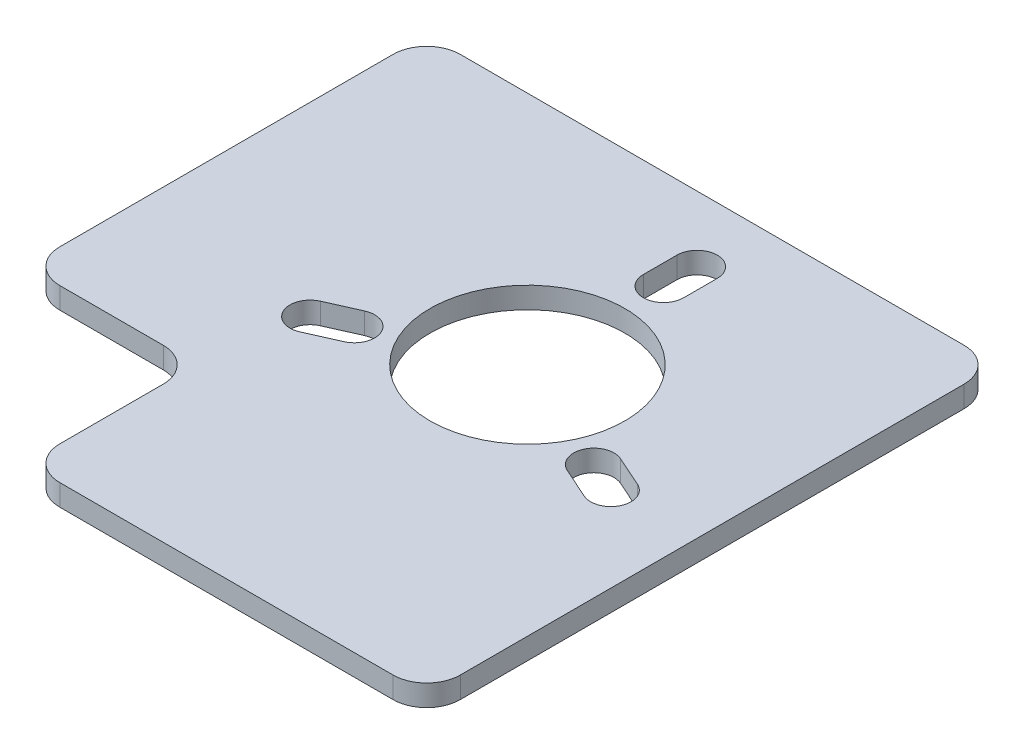
ISO-10303-21;
HEADER;
FILE_DESCRIPTION(('STEP AP214'),'2;1');
FILE_NAME('part.step','',(''),(''),'','','');
FILE_SCHEMA(('AUTOMOTIVE_DESIGN { 1 0 10303 214 1 1 1 1 }'));
ENDSEC;
DATA;
#1=APPLICATION_CONTEXT('core data for automotive mechanical design processes');
#2=APPLICATION_PROTOCOL_DEFINITION('international standard','automotive_design',2000,#1);
#3=PRODUCT_CONTEXT('',#1,'mechanical');
#4=PRODUCT('Part','Part','',(#3));
#5=PRODUCT_RELATED_PRODUCT_CATEGORY('part','',(#4));
#6=PRODUCT_DEFINITION_FORMATION('','',#4);
#7=PRODUCT_DEFINITION_CONTEXT('part definition',#1,'design');
#8=PRODUCT_DEFINITION('design','',#6,#7);
#9=PRODUCT_DEFINITION_SHAPE('','',#8);
#10=(LENGTH_UNIT() NAMED_UNIT(*) SI_UNIT(.MILLI.,.METRE.));
#11=(NAMED_UNIT(*) PLANE_ANGLE_UNIT() SI_UNIT($,.RADIAN.));
#12=(NAMED_UNIT(*) SI_UNIT($,.STERADIAN.) SOLID_ANGLE_UNIT());
#13=UNCERTAINTY_MEASURE_WITH_UNIT(LENGTH_MEASURE(1.E-05),#10,'distance_accuracy_value','');
#14=(GEOMETRIC_REPRESENTATION_CONTEXT(3) GLOBAL_UNCERTAINTY_ASSIGNED_CONTEXT((#13)) GLOBAL_UNIT_ASSIGNED_CONTEXT((#10,
#11,#12)) REPRESENTATION_CONTEXT('',''));
#15=CARTESIAN_POINT('',(0.,0.,0.));
#16=DIRECTION('',(0.,0.,1.));
#17=DIRECTION('',(1.,0.,0.));
#18=AXIS2_PLACEMENT_3D('',#15,#16,#17);
#19=CARTESIAN_POINT('',(0.,6.35,0.));
#20=DIRECTION('',(0.,-1.,0.));
#21=DIRECTION('',(0.,0.,-1.));
#22=AXIS2_PLACEMENT_3D('',#19,#20,#21);
#23=PLANE('',#22);
#24=DIRECTION('',(0.,0.,1.));
#25=VECTOR('',#24,1.);
#26=CARTESIAN_POINT('',(94.,6.35,-150.5));
#27=LINE('',#26,#25);
#28=CARTESIAN_POINT('',(94.,6.35,-150.5));
#29=VERTEX_POINT('',#28);
#30=CARTESIAN_POINT('',(94.,6.35,-140.5));
#31=VERTEX_POINT('',#30);
#32=EDGE_CURVE('E231',#29,#31,#27,.T.);
#33=ORIENTED_EDGE('',*,*,#32,.F.);
#34=CARTESIAN_POINT('',(100.,6.35,-150.5));
#35=DIRECTION('',(0.,1.,0.));
#36=DIRECTION('',(0.,0.,1.));
#37=AXIS2_PLACEMENT_3D('',#34,#35,#36);
#38=CIRCLE('',#37,6.00000000000002);
#39=CARTESIAN_POINT('',(106.,6.35,-150.5));
#40=VERTEX_POINT('',#39);
#41=EDGE_CURVE('E56',#40,#29,#38,.T.);
#42=ORIENTED_EDGE('',*,*,#41,.F.);
#43=DIRECTION('',(0.,0.,-1.));
#44=VECTOR('',#43,1.);
#45=CARTESIAN_POINT('',(106.,6.35,-150.5));
#46=LINE('',#45,#44);
#47=CARTESIAN_POINT('',(106.,6.35,-140.5));
#48=VERTEX_POINT('',#47);
#49=EDGE_CURVE('E222',#48,#40,#46,.T.);
#50=ORIENTED_EDGE('',*,*,#49,.F.);
#51=CARTESIAN_POINT('',(100.,6.35,-140.5));
#52=DIRECTION('',(0.,1.,0.));
#53=DIRECTION('',(0.,0.,1.));
#54=AXIS2_PLACEMENT_3D('',#51,#52,#53);
#55=CIRCLE('',#54,6.00000000000001);
#56=EDGE_CURVE('E225',#31,#48,#55,.T.);
#57=ORIENTED_EDGE('',*,*,#56,.F.);
#58=EDGE_LOOP('',(#33,#42,#50,#57));
#59=FACE_BOUND('',#58,.T.);
#60=DIRECTION('',(0.9135454576426,0.,-0.406736643075803));
#61=VECTOR('',#60,1.);
#62=CARTESIAN_POINT('',(57.6766924339674,6.35,-74.5886317434302));
#63=LINE('',#62,#61);
#64=CARTESIAN_POINT('',(57.6766924339674,6.35,-74.5886317434302));
#65=VERTEX_POINT('',#64);
#66=CARTESIAN_POINT('',(66.8121470103934,6.35,-78.6559981741882));
#67=VERTEX_POINT('',#66);
#68=EDGE_CURVE('E258',#65,#67,#63,.T.);
#69=ORIENTED_EDGE('',*,*,#68,.F.);
#70=CARTESIAN_POINT('',(55.2362725755126,6.35,-80.0699044892858));
#71=DIRECTION('',(0.,1.,0.));
#72=DIRECTION('',(0.,0.,1.));
#73=AXIS2_PLACEMENT_3D('',#70,#71,#72);
#74=CIRCLE('',#73,6.);
#75=CARTESIAN_POINT('',(52.7958527170578,6.35,-85.5511772351414));
#76=VERTEX_POINT('',#75);
#77=EDGE_CURVE('E64',#76,#65,#74,.T.);
#78=ORIENTED_EDGE('',*,*,#77,.F.);
#79=DIRECTION('',(-0.913545457642601,0.,0.4067366430758));
#80=VECTOR('',#79,1.);
#81=CARTESIAN_POINT('',(52.7958527170578,6.35,-85.5511772351414));
#82=LINE('',#81,#80);
#83=CARTESIAN_POINT('',(61.9313072934838,6.35,-89.6185436658994));
#84=VERTEX_POINT('',#83);
#85=EDGE_CURVE('E251',#84,#76,#82,.T.);
#86=ORIENTED_EDGE('',*,*,#85,.F.);
#87=CARTESIAN_POINT('',(64.3717271519386,6.35,-84.1372709200438));
#88=DIRECTION('',(0.,1.,0.));
#89=DIRECTION('',(0.,0.,1.));
#90=AXIS2_PLACEMENT_3D('',#87,#88,#89);
#91=CIRCLE('',#90,5.99999999999998);
#92=EDGE_CURVE('E254',#67,#84,#91,.T.);
#93=ORIENTED_EDGE('',*,*,#92,.F.);
#94=EDGE_LOOP('',(#69,#78,#86,#93));
#95=FACE_BOUND('',#94,.T.);
#96=DIRECTION('',(-0.913545457642603,0.,-0.406736643075795));
#97=VECTOR('',#96,1.);
#98=CARTESIAN_POINT('',(147.204147282942,6.35,-85.5511772351417));
#99=LINE('',#98,#97);
#100=CARTESIAN_POINT('',(147.204147282942,6.35,-85.5511772351417));
#101=VERTEX_POINT('',#100);
#102=CARTESIAN_POINT('',(138.068692706516,6.35,-89.6185436658997));
#103=VERTEX_POINT('',#102);
#104=EDGE_CURVE('E289',#101,#103,#99,.T.);
#105=ORIENTED_EDGE('',*,*,#104,.F.);
#106=CARTESIAN_POINT('',(144.763727424488,6.35,-80.0699044892861));
#107=DIRECTION('',(0.,1.,0.));
#108=DIRECTION('',(0.,0.,1.));
#109=AXIS2_PLACEMENT_3D('',#106,#107,#108);
#110=CIRCLE('',#109,6.00000000000002);
#111=CARTESIAN_POINT('',(142.323307566033,6.35,-74.5886317434304));
#112=VERTEX_POINT('',#111);
#113=EDGE_CURVE('E250',#112,#101,#110,.T.);
#114=ORIENTED_EDGE('',*,*,#113,.F.);
#115=DIRECTION('',(0.913545457642604,0.,0.406736643075793));
#116=VECTOR('',#115,1.);
#117=CARTESIAN_POINT('',(142.323307566033,6.35,-74.5886317434304));
#118=LINE('',#117,#116);
#119=CARTESIAN_POINT('',(133.187852989607,6.35,-78.6559981741884));
#120=VERTEX_POINT('',#119);
#121=EDGE_CURVE('E282',#120,#112,#118,.T.);
#122=ORIENTED_EDGE('',*,*,#121,.F.);
#123=CARTESIAN_POINT('',(135.628272848062,6.35,-84.137270920044));
#124=DIRECTION('',(0.,1.,0.));
#125=DIRECTION('',(0.,0.,1.));
#126=AXIS2_PLACEMENT_3D('',#123,#124,#125);
#127=CIRCLE('',#126,6.00000000000002);
#128=EDGE_CURVE('E285',#103,#120,#127,.T.);
#129=ORIENTED_EDGE('',*,*,#128,.F.);
#130=EDGE_LOOP('',(#105,#114,#122,#129));
#131=FACE_BOUND('',#130,.T.);
#132=DIRECTION('',(0.,0.,-1.));
#133=VECTOR('',#132,1.);
#134=CARTESIAN_POINT('',(170.,6.35,0.));
#135=LINE('',#134,#133);
#136=CARTESIAN_POINT('',(170.,6.35,-10.));
#137=VERTEX_POINT('',#136);
#138=CARTESIAN_POINT('',(170.,6.35,-160.));
#139=VERTEX_POINT('',#138);
#140=EDGE_CURVE('E328',#137,#139,#135,.T.);
#141=ORIENTED_EDGE('',*,*,#140,.T.);
#142=CARTESIAN_POINT('',(160.,6.35,-160.));
#143=DIRECTION('',(0.,-1.,0.));
#144=DIRECTION('',(0.,0.,-1.));
#145=AXIS2_PLACEMENT_3D('',#142,#143,#144);
#146=CIRCLE('',#145,10.);
#147=CARTESIAN_POINT('',(160.,6.35,-170.));
#148=VERTEX_POINT('',#147);
#149=EDGE_CURVE('E372',#139,#148,#146,.F.);
#150=ORIENTED_EDGE('',*,*,#149,.T.);
#151=DIRECTION('',(-1.,0.,0.));
#152=VECTOR('',#151,1.);
#153=CARTESIAN_POINT('',(0.,6.35,-170.));
#154=LINE('',#153,#152);
#155=CARTESIAN_POINT('',(10.,6.35,-170.));
#156=VERTEX_POINT('',#155);
#157=EDGE_CURVE('E331',#148,#156,#154,.T.);
#158=ORIENTED_EDGE('',*,*,#157,.T.);
#159=CARTESIAN_POINT('',(10.,6.35,-160.));
#160=DIRECTION('',(0.,-1.,0.));
#161=DIRECTION('',(0.,0.,-1.));
#162=AXIS2_PLACEMENT_3D('',#159,#160,#161);
#163=CIRCLE('',#162,10.);
#164=CARTESIAN_POINT('',(0.,6.35,-160.));
#165=VERTEX_POINT('',#164);
#166=EDGE_CURVE('E368',#156,#165,#163,.F.);
#167=ORIENTED_EDGE('',*,*,#166,.T.);
#168=DIRECTION('',(0.,0.,1.));
#169=VECTOR('',#168,1.);
#170=CARTESIAN_POINT('',(0.,6.35,0.));
#171=LINE('',#170,#169);
#172=CARTESIAN_POINT('',(0.,6.35,-60.8));
#173=VERTEX_POINT('',#172);
#174=EDGE_CURVE('E321',#165,#173,#171,.T.);
#175=ORIENTED_EDGE('',*,*,#174,.T.);
#176=CARTESIAN_POINT('',(10.,6.35,-60.8));
#177=DIRECTION('',(0.,-1.,0.));
#178=DIRECTION('',(0.,0.,-1.));
#179=AXIS2_PLACEMENT_3D('',#176,#177,#178);
#180=CIRCLE('',#179,10.);
#181=CARTESIAN_POINT('',(10.,6.35,-50.8));
#182=VERTEX_POINT('',#181);
#183=EDGE_CURVE('E364',#173,#182,#180,.F.);
#184=ORIENTED_EDGE('',*,*,#183,.T.);
#185=DIRECTION('',(-1.,0.,0.));
#186=VECTOR('',#185,1.);
#187=CARTESIAN_POINT('',(0.,6.35,-50.8));
#188=LINE('',#187,#186);
#189=CARTESIAN_POINT('',(40.8,6.35,-50.8));
#190=VERTEX_POINT('',#189);
#191=EDGE_CURVE('E307',#190,#182,#188,.T.);
#192=ORIENTED_EDGE('',*,*,#191,.F.);
#193=CARTESIAN_POINT('',(40.8,6.35,-40.8));
#194=DIRECTION('',(0.,-1.,0.));
#195=DIRECTION('',(0.,0.,-1.));
#196=AXIS2_PLACEMENT_3D('',#193,#194,#195);
#197=CIRCLE('',#196,10.);
#198=CARTESIAN_POINT('',(50.8,6.35,-40.8));
#199=VERTEX_POINT('',#198);
#200=EDGE_CURVE('E49',#190,#199,#197,.T.);
#201=ORIENTED_EDGE('',*,*,#200,.T.);
#202=DIRECTION('',(0.,0.,-1.));
#203=VECTOR('',#202,1.);
#204=CARTESIAN_POINT('',(50.8,6.35,0.));
#205=LINE('',#204,#203);
#206=CARTESIAN_POINT('',(50.8,6.35,-10.));
#207=VERTEX_POINT('',#206);
#208=EDGE_CURVE('E237',#207,#199,#205,.T.);
#209=ORIENTED_EDGE('',*,*,#208,.F.);
#210=CARTESIAN_POINT('',(60.8,6.35,-10.));
#211=DIRECTION('',(0.,-1.,0.));
#212=DIRECTION('',(0.,0.,-1.));
#213=AXIS2_PLACEMENT_3D('',#210,#211,#212);
#214=CIRCLE('',#213,10.);
#215=CARTESIAN_POINT('',(60.8,6.35,0.));
#216=VERTEX_POINT('',#215);
#217=EDGE_CURVE('E366',#207,#216,#214,.F.);
#218=ORIENTED_EDGE('',*,*,#217,.T.);
#219=DIRECTION('',(1.,0.,0.));
#220=VECTOR('',#219,1.);
#221=CARTESIAN_POINT('',(0.,6.35,0.));
#222=LINE('',#221,#220);
#223=CARTESIAN_POINT('',(160.,6.35,0.));
#224=VERTEX_POINT('',#223);
#225=EDGE_CURVE('E324',#216,#224,#222,.T.);
#226=ORIENTED_EDGE('',*,*,#225,.T.);
#227=CARTESIAN_POINT('',(160.,6.35,-10.));
#228=DIRECTION('',(0.,-1.,0.));
#229=DIRECTION('',(0.,0.,-1.));
#230=AXIS2_PLACEMENT_3D('',#227,#228,#229);
#231=CIRCLE('',#230,10.);
#232=EDGE_CURVE('E370',#224,#137,#231,.F.);
#233=ORIENTED_EDGE('',*,*,#232,.T.);
#234=EDGE_LOOP('',(#141,#150,#158,#167,#175,#184,#192,#201,#209,#218,#226,#233));
#235=FACE_BOUND('',#234,.T.);
#236=CARTESIAN_POINT('',(100.,6.35,-100.));
#237=DIRECTION('',(0.,1.,0.));
#238=DIRECTION('',(0.,0.,1.));
#239=AXIS2_PLACEMENT_3D('',#236,#237,#238);
#240=CIRCLE('',#239,29.);
#241=CARTESIAN_POINT('',(100.,6.35,-71.));
#242=VERTEX_POINT('',#241);
#243=EDGE_CURVE('E315',#242,#242,#240,.T.);
#244=ORIENTED_EDGE('',*,*,#243,.F.);
#245=EDGE_LOOP('',(#244));
#246=FACE_BOUND('',#245,.T.);
#247=ADVANCED_FACE('F41',(#59,#95,#131,#235,#246),#23,.F.);
#248=CARTESIAN_POINT('',(0.,0.,0.));
#249=DIRECTION('',(0.,-1.,0.));
#250=DIRECTION('',(0.,0.,-1.));
#251=AXIS2_PLACEMENT_3D('',#248,#249,#250);
#252=PLANE('',#251);
#253=CARTESIAN_POINT('',(100.,0.,-150.5));
#254=DIRECTION('',(0.,1.,0.));
#255=DIRECTION('',(0.,0.,1.));
#256=AXIS2_PLACEMENT_3D('',#253,#254,#255);
#257=CIRCLE('',#256,6.00000000000002);
#258=CARTESIAN_POINT('',(106.,0.,-150.5));
#259=VERTEX_POINT('',#258);
#260=CARTESIAN_POINT('',(94.,0.,-150.5));
#261=VERTEX_POINT('',#260);
#262=EDGE_CURVE('E203',#259,#261,#257,.T.);
#263=ORIENTED_EDGE('',*,*,#262,.T.);
#264=DIRECTION('',(0.,0.,1.));
#265=VECTOR('',#264,1.);
#266=CARTESIAN_POINT('',(94.,0.,-150.5));
#267=LINE('',#266,#265);
#268=CARTESIAN_POINT('',(94.,0.,-140.5));
#269=VERTEX_POINT('',#268);
#270=EDGE_CURVE('E213',#261,#269,#267,.T.);
#271=ORIENTED_EDGE('',*,*,#270,.T.);
#272=CARTESIAN_POINT('',(100.,0.,-140.5));
#273=DIRECTION('',(0.,1.,0.));
#274=DIRECTION('',(0.,0.,1.));
#275=AXIS2_PLACEMENT_3D('',#272,#273,#274);
#276=CIRCLE('',#275,6.00000000000001);
#277=CARTESIAN_POINT('',(106.,0.,-140.5));
#278=VERTEX_POINT('',#277);
#279=EDGE_CURVE('E217',#269,#278,#276,.T.);
#280=ORIENTED_EDGE('',*,*,#279,.T.);
#281=DIRECTION('',(0.,0.,-1.));
#282=VECTOR('',#281,1.);
#283=CARTESIAN_POINT('',(106.,0.,-150.5));
#284=LINE('',#283,#282);
#285=EDGE_CURVE('E209',#278,#259,#284,.T.);
#286=ORIENTED_EDGE('',*,*,#285,.T.);
#287=EDGE_LOOP('',(#263,#271,#280,#286));
#288=FACE_BOUND('',#287,.T.);
#289=CARTESIAN_POINT('',(55.2362725755126,0.,-80.0699044892858));
#290=DIRECTION('',(0.,1.,0.));
#291=DIRECTION('',(0.,0.,1.));
#292=AXIS2_PLACEMENT_3D('',#289,#290,#291);
#293=CIRCLE('',#292,6.);
#294=CARTESIAN_POINT('',(52.7958527170578,0.,-85.5511772351414));
#295=VERTEX_POINT('',#294);
#296=CARTESIAN_POINT('',(57.6766924339674,0.,-74.5886317434302));
#297=VERTEX_POINT('',#296);
#298=EDGE_CURVE('E255',#295,#297,#293,.T.);
#299=ORIENTED_EDGE('',*,*,#298,.T.);
#300=DIRECTION('',(0.9135454576426,0.,-0.406736643075803));
#301=VECTOR('',#300,1.);
#302=CARTESIAN_POINT('',(57.6766924339674,0.,-74.5886317434302));
#303=LINE('',#302,#301);
#304=CARTESIAN_POINT('',(66.8121470103934,0.,-78.6559981741882));
#305=VERTEX_POINT('',#304);
#306=EDGE_CURVE('E267',#297,#305,#303,.T.);
#307=ORIENTED_EDGE('',*,*,#306,.T.);
#308=CARTESIAN_POINT('',(64.3717271519386,0.,-84.1372709200438));
#309=DIRECTION('',(0.,1.,0.));
#310=DIRECTION('',(0.,0.,1.));
#311=AXIS2_PLACEMENT_3D('',#308,#309,#310);
#312=CIRCLE('',#311,5.99999999999998);
#313=CARTESIAN_POINT('',(61.9313072934838,0.,-89.6185436658994));
#314=VERTEX_POINT('',#313);
#315=EDGE_CURVE('E264',#305,#314,#312,.T.);
#316=ORIENTED_EDGE('',*,*,#315,.T.);
#317=DIRECTION('',(-0.913545457642601,0.,0.4067366430758));
#318=VECTOR('',#317,1.);
#319=CARTESIAN_POINT('',(52.7958527170578,0.,-85.5511772351414));
#320=LINE('',#319,#318);
#321=EDGE_CURVE('E243',#314,#295,#320,.T.);
#322=ORIENTED_EDGE('',*,*,#321,.T.);
#323=EDGE_LOOP('',(#299,#307,#316,#322));
#324=FACE_BOUND('',#323,.T.);
#325=CARTESIAN_POINT('',(144.763727424488,0.,-80.0699044892861));
#326=DIRECTION('',(0.,1.,0.));
#327=DIRECTION('',(0.,0.,1.));
#328=AXIS2_PLACEMENT_3D('',#325,#326,#327);
#329=CIRCLE('',#328,6.00000000000002);
#330=CARTESIAN_POINT('',(142.323307566033,0.,-74.5886317434304));
#331=VERTEX_POINT('',#330);
#332=CARTESIAN_POINT('',(147.204147282942,0.,-85.5511772351417));
#333=VERTEX_POINT('',#332);
#334=EDGE_CURVE('E286',#331,#333,#329,.T.);
#335=ORIENTED_EDGE('',*,*,#334,.T.);
#336=DIRECTION('',(-0.913545457642603,0.,-0.406736643075795));
#337=VECTOR('',#336,1.);
#338=CARTESIAN_POINT('',(147.204147282942,0.,-85.5511772351417));
#339=LINE('',#338,#337);
#340=CARTESIAN_POINT('',(138.068692706516,0.,-89.6185436658996));
#341=VERTEX_POINT('',#340);
#342=EDGE_CURVE('E298',#333,#341,#339,.T.);
#343=ORIENTED_EDGE('',*,*,#342,.T.);
#344=CARTESIAN_POINT('',(135.628272848062,0.,-84.137270920044));
#345=DIRECTION('',(0.,1.,0.));
#346=DIRECTION('',(0.,0.,1.));
#347=AXIS2_PLACEMENT_3D('',#344,#345,#346);
#348=CIRCLE('',#347,6.00000000000002);
#349=CARTESIAN_POINT('',(133.187852989607,0.,-78.6559981741884));
#350=VERTEX_POINT('',#349);
#351=EDGE_CURVE('E295',#341,#350,#348,.T.);
#352=ORIENTED_EDGE('',*,*,#351,.T.);
#353=DIRECTION('',(0.913545457642604,0.,0.406736643075793));
#354=VECTOR('',#353,1.);
#355=CARTESIAN_POINT('',(142.323307566033,0.,-74.5886317434304));
#356=LINE('',#355,#354);
#357=EDGE_CURVE('E275',#350,#331,#356,.T.);
#358=ORIENTED_EDGE('',*,*,#357,.T.);
#359=EDGE_LOOP('',(#335,#343,#352,#358));
#360=FACE_BOUND('',#359,.T.);
#361=DIRECTION('',(-1.,0.,0.));
#362=VECTOR('',#361,1.);
#363=CARTESIAN_POINT('',(0.,0.,-170.));
#364=LINE('',#363,#362);
#365=CARTESIAN_POINT('',(160.,0.,-170.));
#366=VERTEX_POINT('',#365);
#367=CARTESIAN_POINT('',(10.,0.,-170.));
#368=VERTEX_POINT('',#367);
#369=EDGE_CURVE('E325',#366,#368,#364,.T.);
#370=ORIENTED_EDGE('',*,*,#369,.F.);
#371=CARTESIAN_POINT('',(160.,0.,-160.));
#372=DIRECTION('',(0.,-1.,0.));
#373=DIRECTION('',(0.,0.,-1.));
#374=AXIS2_PLACEMENT_3D('',#371,#372,#373);
#375=CIRCLE('',#374,10.);
#376=CARTESIAN_POINT('',(170.,0.,-160.));
#377=VERTEX_POINT('',#376);
#378=EDGE_CURVE('E357',#366,#377,#375,.T.);
#379=ORIENTED_EDGE('',*,*,#378,.T.);
#380=DIRECTION('',(0.,0.,-1.));
#381=VECTOR('',#380,1.);
#382=CARTESIAN_POINT('',(170.,0.,0.));
#383=LINE('',#382,#381);
#384=CARTESIAN_POINT('',(170.,0.,-10.));
#385=VERTEX_POINT('',#384);
#386=EDGE_CURVE('E340',#385,#377,#383,.T.);
#387=ORIENTED_EDGE('',*,*,#386,.F.);
#388=CARTESIAN_POINT('',(160.,0.,-10.));
#389=DIRECTION('',(0.,-1.,0.));
#390=DIRECTION('',(0.,0.,-1.));
#391=AXIS2_PLACEMENT_3D('',#388,#389,#390);
#392=CIRCLE('',#391,10.);
#393=CARTESIAN_POINT('',(160.,0.,0.));
#394=VERTEX_POINT('',#393);
#395=EDGE_CURVE('E355',#385,#394,#392,.T.);
#396=ORIENTED_EDGE('',*,*,#395,.T.);
#397=DIRECTION('',(1.,0.,0.));
#398=VECTOR('',#397,1.);
#399=CARTESIAN_POINT('',(0.,0.,0.));
#400=LINE('',#399,#398);
#401=CARTESIAN_POINT('',(60.8,0.,0.));
#402=VERTEX_POINT('',#401);
#403=EDGE_CURVE('E337',#402,#394,#400,.T.);
#404=ORIENTED_EDGE('',*,*,#403,.F.);
#405=CARTESIAN_POINT('',(60.8,0.,-10.));
#406=DIRECTION('',(0.,-1.,0.));
#407=DIRECTION('',(0.,0.,-1.));
#408=AXIS2_PLACEMENT_3D('',#405,#406,#407);
#409=CIRCLE('',#408,10.);
#410=CARTESIAN_POINT('',(50.8,0.,-10.));
#411=VERTEX_POINT('',#410);
#412=EDGE_CURVE('E351',#402,#411,#409,.T.);
#413=ORIENTED_EDGE('',*,*,#412,.T.);
#414=DIRECTION('',(0.,0.,-1.));
#415=VECTOR('',#414,1.);
#416=CARTESIAN_POINT('',(50.8,0.,0.));
#417=LINE('',#416,#415);
#418=CARTESIAN_POINT('',(50.8,0.,-40.8));
#419=VERTEX_POINT('',#418);
#420=EDGE_CURVE('E303',#411,#419,#417,.T.);
#421=ORIENTED_EDGE('',*,*,#420,.T.);
#422=CARTESIAN_POINT('',(40.8,0.,-40.8));
#423=DIRECTION('',(0.,-1.,0.));
#424=DIRECTION('',(0.,0.,-1.));
#425=AXIS2_PLACEMENT_3D('',#422,#423,#424);
#426=CIRCLE('',#425,10.);
#427=CARTESIAN_POINT('',(40.8,0.,-50.8));
#428=VERTEX_POINT('',#427);
#429=EDGE_CURVE('E11',#419,#428,#426,.F.);
#430=ORIENTED_EDGE('',*,*,#429,.T.);
#431=DIRECTION('',(-1.,0.,0.));
#432=VECTOR('',#431,1.);
#433=CARTESIAN_POINT('',(0.,0.,-50.8));
#434=LINE('',#433,#432);
#435=CARTESIAN_POINT('',(10.,0.,-50.8));
#436=VERTEX_POINT('',#435);
#437=EDGE_CURVE('E306',#428,#436,#434,.T.);
#438=ORIENTED_EDGE('',*,*,#437,.T.);
#439=CARTESIAN_POINT('',(10.,0.,-60.8));
#440=DIRECTION('',(0.,-1.,0.));
#441=DIRECTION('',(0.,0.,-1.));
#442=AXIS2_PLACEMENT_3D('',#439,#440,#441);
#443=CIRCLE('',#442,10.);
#444=CARTESIAN_POINT('',(0.,0.,-60.8));
#445=VERTEX_POINT('',#444);
#446=EDGE_CURVE('E349',#436,#445,#443,.T.);
#447=ORIENTED_EDGE('',*,*,#446,.T.);
#448=DIRECTION('',(0.,0.,1.));
#449=VECTOR('',#448,1.);
#450=CARTESIAN_POINT('',(0.,0.,0.));
#451=LINE('',#450,#449);
#452=CARTESIAN_POINT('',(0.,0.,-160.));
#453=VERTEX_POINT('',#452);
#454=EDGE_CURVE('E318',#453,#445,#451,.T.);
#455=ORIENTED_EDGE('',*,*,#454,.F.);
#456=CARTESIAN_POINT('',(10.,0.,-160.));
#457=DIRECTION('',(0.,-1.,0.));
#458=DIRECTION('',(0.,0.,-1.));
#459=AXIS2_PLACEMENT_3D('',#456,#457,#458);
#460=CIRCLE('',#459,10.);
#461=EDGE_CURVE('E353',#453,#368,#460,.T.);
#462=ORIENTED_EDGE('',*,*,#461,.T.);
#463=EDGE_LOOP('',(#370,#379,#387,#396,#404,#413,#421,#430,#438,#447,#455,#462));
#464=FACE_BOUND('',#463,.T.);
#465=CARTESIAN_POINT('',(100.,0.,-100.));
#466=DIRECTION('',(0.,1.,0.));
#467=DIRECTION('',(0.,0.,1.));
#468=AXIS2_PLACEMENT_3D('',#465,#466,#467);
#469=CIRCLE('',#468,29.);
#470=CARTESIAN_POINT('',(100.,0.,-71.));
#471=VERTEX_POINT('',#470);
#472=EDGE_CURVE('E310',#471,#471,#469,.T.);
#473=ORIENTED_EDGE('',*,*,#472,.T.);
#474=EDGE_LOOP('',(#473));
#475=FACE_BOUND('',#474,.T.);
#476=ADVANCED_FACE('F219',(#288,#324,#360,#464,#475),#252,.T.);
#477=CARTESIAN_POINT('',(0.,6.35,0.));
#478=DIRECTION('',(1.,0.,0.));
#479=DIRECTION('',(0.,0.,-1.));
#480=AXIS2_PLACEMENT_3D('',#477,#478,#479);
#481=PLANE('',#480);
#482=ORIENTED_EDGE('',*,*,#174,.F.);
#483=DIRECTION('',(0.,-1.,0.));
#484=VECTOR('',#483,1.);
#485=CARTESIAN_POINT('',(0.,6.35,-160.));
#486=LINE('',#485,#484);
#487=EDGE_CURVE('E381',#165,#453,#486,.T.);
#488=ORIENTED_EDGE('',*,*,#487,.T.);
#489=ORIENTED_EDGE('',*,*,#454,.T.);
#490=DIRECTION('',(0.,1.,0.));
#491=VECTOR('',#490,1.);
#492=CARTESIAN_POINT('',(0.,6.35,-60.8));
#493=LINE('',#492,#491);
#494=EDGE_CURVE('E378',#445,#173,#493,.T.);
#495=ORIENTED_EDGE('',*,*,#494,.T.);
#496=EDGE_LOOP('',(#482,#488,#489,#495));
#497=FACE_BOUND('',#496,.T.);
#498=ADVANCED_FACE('F419',(#497),#481,.F.);
#499=CARTESIAN_POINT('',(0.,6.35,0.));
#500=DIRECTION('',(0.,0.,-1.));
#501=DIRECTION('',(-1.,0.,0.));
#502=AXIS2_PLACEMENT_3D('',#499,#500,#501);
#503=PLANE('',#502);
#504=ORIENTED_EDGE('',*,*,#403,.T.);
#505=DIRECTION('',(0.,-1.,0.));
#506=VECTOR('',#505,1.);
#507=CARTESIAN_POINT('',(160.,6.35,0.));
#508=LINE('',#507,#506);
#509=EDGE_CURVE('E376',#394,#224,#508,.F.);
#510=ORIENTED_EDGE('',*,*,#509,.T.);
#511=ORIENTED_EDGE('',*,*,#225,.F.);
#512=DIRECTION('',(0.,1.,0.));
#513=VECTOR('',#512,1.);
#514=CARTESIAN_POINT('',(60.8,6.35,0.));
#515=LINE('',#514,#513);
#516=EDGE_CURVE('E374',#216,#402,#515,.F.);
#517=ORIENTED_EDGE('',*,*,#516,.T.);
#518=EDGE_LOOP('',(#504,#510,#511,#517));
#519=FACE_BOUND('',#518,.T.);
#520=ADVANCED_FACE('F445',(#519),#503,.F.);
#521=CARTESIAN_POINT('',(170.,6.35,0.));
#522=DIRECTION('',(-1.,0.,0.));
#523=DIRECTION('',(0.,0.,1.));
#524=AXIS2_PLACEMENT_3D('',#521,#522,#523);
#525=PLANE('',#524);
#526=ORIENTED_EDGE('',*,*,#386,.T.);
#527=DIRECTION('',(0.,-1.,0.));
#528=VECTOR('',#527,1.);
#529=CARTESIAN_POINT('',(170.,6.35,-160.));
#530=LINE('',#529,#528);
#531=EDGE_CURVE('E362',#377,#139,#530,.F.);
#532=ORIENTED_EDGE('',*,*,#531,.T.);
#533=ORIENTED_EDGE('',*,*,#140,.F.);
#534=DIRECTION('',(0.,-1.,0.));
#535=VECTOR('',#534,1.);
#536=CARTESIAN_POINT('',(170.,6.35,-10.));
#537=LINE('',#536,#535);
#538=EDGE_CURVE('E359',#137,#385,#537,.T.);
#539=ORIENTED_EDGE('',*,*,#538,.T.);
#540=EDGE_LOOP('',(#526,#532,#533,#539));
#541=FACE_BOUND('',#540,.T.);
#542=ADVANCED_FACE('F435',(#541),#525,.F.);
#543=CARTESIAN_POINT('',(0.,6.35,-170.));
#544=DIRECTION('',(0.,0.,1.));
#545=DIRECTION('',(1.,0.,0.));
#546=AXIS2_PLACEMENT_3D('',#543,#544,#545);
#547=PLANE('',#546);
#548=ORIENTED_EDGE('',*,*,#157,.F.);
#549=DIRECTION('',(0.,-1.,0.));
#550=VECTOR('',#549,1.);
#551=CARTESIAN_POINT('',(160.,6.35,-170.));
#552=LINE('',#551,#550);
#553=EDGE_CURVE('E346',#148,#366,#552,.T.);
#554=ORIENTED_EDGE('',*,*,#553,.T.);
#555=ORIENTED_EDGE('',*,*,#369,.T.);
#556=DIRECTION('',(0.,-1.,0.));
#557=VECTOR('',#556,1.);
#558=CARTESIAN_POINT('',(10.,6.35,-170.));
#559=LINE('',#558,#557);
#560=EDGE_CURVE('E334',#368,#156,#559,.F.);
#561=ORIENTED_EDGE('',*,*,#560,.T.);
#562=EDGE_LOOP('',(#548,#554,#555,#561));
#563=FACE_BOUND('',#562,.T.);
#564=ADVANCED_FACE('F427',(#563),#547,.F.);
#565=CARTESIAN_POINT('',(100.,6.35,-100.));
#566=DIRECTION('',(0.,-1.,0.));
#567=DIRECTION('',(0.,0.,-1.));
#568=AXIS2_PLACEMENT_3D('',#565,#566,#567);
#569=CYLINDRICAL_SURFACE('',#568,29.);
#570=ORIENTED_EDGE('',*,*,#243,.T.);
#571=EDGE_LOOP('',(#570));
#572=FACE_BOUND('',#571,.T.);
#573=ORIENTED_EDGE('',*,*,#472,.F.);
#574=EDGE_LOOP('',(#573));
#575=FACE_BOUND('',#574,.T.);
#576=ADVANCED_FACE('F466',(#572,#575),#569,.F.);
#577=CARTESIAN_POINT('',(0.,0.,-50.8));
#578=DIRECTION('',(0.,0.,-1.));
#579=DIRECTION('',(-1.,0.,0.));
#580=AXIS2_PLACEMENT_3D('',#577,#578,#579);
#581=PLANE('',#580);
#582=ORIENTED_EDGE('',*,*,#437,.F.);
#583=DIRECTION('',(0.,1.,0.));
#584=VECTOR('',#583,1.);
#585=CARTESIAN_POINT('',(40.8,6.35,-50.8));
#586=LINE('',#585,#584);
#587=EDGE_CURVE('E386',#428,#190,#586,.T.);
#588=ORIENTED_EDGE('',*,*,#587,.T.);
#589=ORIENTED_EDGE('',*,*,#191,.T.);
#590=DIRECTION('',(0.,1.,0.));
#591=VECTOR('',#590,1.);
#592=CARTESIAN_POINT('',(10.,0.,-50.8));
#593=LINE('',#592,#591);
#594=EDGE_CURVE('E384',#182,#436,#593,.F.);
#595=ORIENTED_EDGE('',*,*,#594,.T.);
#596=EDGE_LOOP('',(#582,#588,#589,#595));
#597=FACE_BOUND('',#596,.T.);
#598=ADVANCED_FACE('F412',(#597),#581,.F.);
#599=CARTESIAN_POINT('',(50.8,0.,0.));
#600=DIRECTION('',(1.,0.,0.));
#601=DIRECTION('',(0.,0.,-1.));
#602=AXIS2_PLACEMENT_3D('',#599,#600,#601);
#603=PLANE('',#602);
#604=ORIENTED_EDGE('',*,*,#208,.T.);
#605=DIRECTION('',(0.,1.,0.));
#606=VECTOR('',#605,1.);
#607=CARTESIAN_POINT('',(50.8,0.,-40.8));
#608=LINE('',#607,#606);
#609=EDGE_CURVE('E392',#199,#419,#608,.F.);
#610=ORIENTED_EDGE('',*,*,#609,.T.);
#611=ORIENTED_EDGE('',*,*,#420,.F.);
#612=DIRECTION('',(0.,1.,0.));
#613=VECTOR('',#612,1.);
#614=CARTESIAN_POINT('',(50.8,0.,-10.));
#615=LINE('',#614,#613);
#616=EDGE_CURVE('E389',#411,#207,#615,.T.);
#617=ORIENTED_EDGE('',*,*,#616,.T.);
#618=EDGE_LOOP('',(#604,#610,#611,#617));
#619=FACE_BOUND('',#618,.T.);
#620=ADVANCED_FACE('F401',(#619),#603,.F.);
#621=CARTESIAN_POINT('',(160.,6.35,-160.));
#622=DIRECTION('',(0.,-1.,0.));
#623=DIRECTION('',(0.,0.,-1.));
#624=AXIS2_PLACEMENT_3D('',#621,#622,#623);
#625=CYLINDRICAL_SURFACE('',#624,10.);
#626=ORIENTED_EDGE('',*,*,#149,.F.);
#627=ORIENTED_EDGE('',*,*,#531,.F.);
#628=ORIENTED_EDGE('',*,*,#378,.F.);
#629=ORIENTED_EDGE('',*,*,#553,.F.);
#630=EDGE_LOOP('',(#626,#627,#628,#629));
#631=FACE_BOUND('',#630,.T.);
#632=ADVANCED_FACE('F431',(#631),#625,.T.);
#633=CARTESIAN_POINT('',(160.,6.35,-10.));
#634=DIRECTION('',(0.,-1.,0.));
#635=DIRECTION('',(0.,0.,-1.));
#636=AXIS2_PLACEMENT_3D('',#633,#634,#635);
#637=CYLINDRICAL_SURFACE('',#636,10.);
#638=ORIENTED_EDGE('',*,*,#232,.F.);
#639=ORIENTED_EDGE('',*,*,#509,.F.);
#640=ORIENTED_EDGE('',*,*,#395,.F.);
#641=ORIENTED_EDGE('',*,*,#538,.F.);
#642=EDGE_LOOP('',(#638,#639,#640,#641));
#643=FACE_BOUND('',#642,.T.);
#644=ADVANCED_FACE('F440',(#643),#637,.T.);
#645=CARTESIAN_POINT('',(10.,6.35,-160.));
#646=DIRECTION('',(0.,-1.,0.));
#647=DIRECTION('',(0.,0.,-1.));
#648=AXIS2_PLACEMENT_3D('',#645,#646,#647);
#649=CYLINDRICAL_SURFACE('',#648,10.);
#650=ORIENTED_EDGE('',*,*,#166,.F.);
#651=ORIENTED_EDGE('',*,*,#560,.F.);
#652=ORIENTED_EDGE('',*,*,#461,.F.);
#653=ORIENTED_EDGE('',*,*,#487,.F.);
#654=EDGE_LOOP('',(#650,#651,#652,#653));
#655=FACE_BOUND('',#654,.T.);
#656=ADVANCED_FACE('F423',(#655),#649,.T.);
#657=CARTESIAN_POINT('',(40.8,0.,-40.8));
#658=DIRECTION('',(0.,-1.,0.));
#659=DIRECTION('',(0.,0.,-1.));
#660=AXIS2_PLACEMENT_3D('',#657,#658,#659);
#661=CYLINDRICAL_SURFACE('',#660,10.);
#662=ORIENTED_EDGE('',*,*,#429,.F.);
#663=ORIENTED_EDGE('',*,*,#609,.F.);
#664=ORIENTED_EDGE('',*,*,#200,.F.);
#665=ORIENTED_EDGE('',*,*,#587,.F.);
#666=EDGE_LOOP('',(#662,#663,#664,#665));
#667=FACE_BOUND('',#666,.T.);
#668=ADVANCED_FACE('F405',(#667),#661,.F.);
#669=CARTESIAN_POINT('',(60.8,0.,-10.));
#670=DIRECTION('',(0.,1.,0.));
#671=DIRECTION('',(0.,0.,1.));
#672=AXIS2_PLACEMENT_3D('',#669,#670,#671);
#673=CYLINDRICAL_SURFACE('',#672,10.);
#674=ORIENTED_EDGE('',*,*,#412,.F.);
#675=ORIENTED_EDGE('',*,*,#516,.F.);
#676=ORIENTED_EDGE('',*,*,#217,.F.);
#677=ORIENTED_EDGE('',*,*,#616,.F.);
#678=EDGE_LOOP('',(#674,#675,#676,#677));
#679=FACE_BOUND('',#678,.T.);
#680=ADVANCED_FACE('F449',(#679),#673,.T.);
#681=CARTESIAN_POINT('',(10.,6.35,-60.8));
#682=DIRECTION('',(0.,1.,0.));
#683=DIRECTION('',(0.,0.,1.));
#684=AXIS2_PLACEMENT_3D('',#681,#682,#683);
#685=CYLINDRICAL_SURFACE('',#684,10.);
#686=ORIENTED_EDGE('',*,*,#446,.F.);
#687=ORIENTED_EDGE('',*,*,#594,.F.);
#688=ORIENTED_EDGE('',*,*,#183,.F.);
#689=ORIENTED_EDGE('',*,*,#494,.F.);
#690=EDGE_LOOP('',(#686,#687,#688,#689));
#691=FACE_BOUND('',#690,.T.);
#692=ADVANCED_FACE('F43',(#691),#685,.T.);
#693=CARTESIAN_POINT('',(144.763727424488,0.,-80.0699044892861));
#694=DIRECTION('',(0.,1.,0.));
#695=DIRECTION('',(0.,0.,1.));
#696=AXIS2_PLACEMENT_3D('',#693,#694,#695);
#697=CYLINDRICAL_SURFACE('',#696,6.00000000000002);
#698=ORIENTED_EDGE('',*,*,#113,.T.);
#699=DIRECTION('',(0.,1.,0.));
#700=VECTOR('',#699,1.);
#701=CARTESIAN_POINT('',(147.204147282942,0.,-85.5511772351417));
#702=LINE('',#701,#700);
#703=EDGE_CURVE('E272',#333,#101,#702,.T.);
#704=ORIENTED_EDGE('',*,*,#703,.F.);
#705=ORIENTED_EDGE('',*,*,#334,.F.);
#706=DIRECTION('',(0.,1.,0.));
#707=VECTOR('',#706,1.);
#708=CARTESIAN_POINT('',(142.323307566033,0.,-74.5886317434304));
#709=LINE('',#708,#707);
#710=EDGE_CURVE('E280',#331,#112,#709,.T.);
#711=ORIENTED_EDGE('',*,*,#710,.T.);
#712=EDGE_LOOP('',(#698,#704,#705,#711));
#713=FACE_BOUND('',#712,.T.);
#714=ADVANCED_FACE('F455',(#713),#697,.F.);
#715=CARTESIAN_POINT('',(142.323307566033,0.,-74.5886317434304));
#716=DIRECTION('',(-0.406736643075793,0.,0.913545457642604));
#717=DIRECTION('',(0.913545457642604,0.,0.406736643075793));
#718=AXIS2_PLACEMENT_3D('',#715,#716,#717);
#719=PLANE('',#718);
#720=ORIENTED_EDGE('',*,*,#121,.T.);
#721=ORIENTED_EDGE('',*,*,#710,.F.);
#722=ORIENTED_EDGE('',*,*,#357,.F.);
#723=DIRECTION('',(0.,1.,0.));
#724=VECTOR('',#723,1.);
#725=CARTESIAN_POINT('',(133.187852989607,0.,-78.6559981741884));
#726=LINE('',#725,#724);
#727=EDGE_CURVE('E278',#350,#120,#726,.T.);
#728=ORIENTED_EDGE('',*,*,#727,.T.);
#729=EDGE_LOOP('',(#720,#721,#722,#728));
#730=FACE_BOUND('',#729,.T.);
#731=ADVANCED_FACE('F511',(#730),#719,.F.);
#732=CARTESIAN_POINT('',(135.628272848062,0.,-84.137270920044));
#733=DIRECTION('',(0.,1.,0.));
#734=DIRECTION('',(0.,0.,1.));
#735=AXIS2_PLACEMENT_3D('',#732,#733,#734);
#736=CYLINDRICAL_SURFACE('',#735,6.00000000000002);
#737=ORIENTED_EDGE('',*,*,#128,.T.);
#738=ORIENTED_EDGE('',*,*,#727,.F.);
#739=ORIENTED_EDGE('',*,*,#351,.F.);
#740=DIRECTION('',(0.,1.,0.));
#741=VECTOR('',#740,1.);
#742=CARTESIAN_POINT('',(138.068692706516,0.,-89.6185436658997));
#743=LINE('',#742,#741);
#744=EDGE_CURVE('E276',#341,#103,#743,.T.);
#745=ORIENTED_EDGE('',*,*,#744,.T.);
#746=EDGE_LOOP('',(#737,#738,#739,#745));
#747=FACE_BOUND('',#746,.T.);
#748=ADVANCED_FACE('F521',(#747),#736,.F.);
#749=CARTESIAN_POINT('',(147.204147282942,0.,-85.5511772351417));
#750=DIRECTION('',(0.406736643075795,0.,-0.913545457642603));
#751=DIRECTION('',(-0.913545457642604,0.,-0.406736643075795));
#752=AXIS2_PLACEMENT_3D('',#749,#750,#751);
#753=PLANE('',#752);
#754=ORIENTED_EDGE('',*,*,#104,.T.);
#755=ORIENTED_EDGE('',*,*,#744,.F.);
#756=ORIENTED_EDGE('',*,*,#342,.F.);
#757=ORIENTED_EDGE('',*,*,#703,.T.);
#758=EDGE_LOOP('',(#754,#755,#756,#757));
#759=FACE_BOUND('',#758,.T.);
#760=ADVANCED_FACE('F531',(#759),#753,.F.);
#761=CARTESIAN_POINT('',(55.2362725755126,0.,-80.0699044892858));
#762=DIRECTION('',(0.,1.,0.));
#763=DIRECTION('',(0.,0.,1.));
#764=AXIS2_PLACEMENT_3D('',#761,#762,#763);
#765=CYLINDRICAL_SURFACE('',#764,6.);
#766=ORIENTED_EDGE('',*,*,#77,.T.);
#767=DIRECTION('',(0.,1.,0.));
#768=VECTOR('',#767,1.);
#769=CARTESIAN_POINT('',(57.6766924339674,0.,-74.5886317434302));
#770=LINE('',#769,#768);
#771=EDGE_CURVE('E241',#297,#65,#770,.T.);
#772=ORIENTED_EDGE('',*,*,#771,.F.);
#773=ORIENTED_EDGE('',*,*,#298,.F.);
#774=DIRECTION('',(0.,1.,0.));
#775=VECTOR('',#774,1.);
#776=CARTESIAN_POINT('',(52.7958527170578,0.,-85.5511772351414));
#777=LINE('',#776,#775);
#778=EDGE_CURVE('E248',#295,#76,#777,.T.);
#779=ORIENTED_EDGE('',*,*,#778,.T.);
#780=EDGE_LOOP('',(#766,#772,#773,#779));
#781=FACE_BOUND('',#780,.T.);
#782=ADVANCED_FACE('F541',(#781),#765,.F.);
#783=CARTESIAN_POINT('',(52.7958527170578,0.,-85.5511772351414));
#784=DIRECTION('',(-0.4067366430758,0.,-0.913545457642601));
#785=DIRECTION('',(-0.913545457642601,0.,0.4067366430758));
#786=AXIS2_PLACEMENT_3D('',#783,#784,#785);
#787=PLANE('',#786);
#788=ORIENTED_EDGE('',*,*,#85,.T.);
#789=ORIENTED_EDGE('',*,*,#778,.F.);
#790=ORIENTED_EDGE('',*,*,#321,.F.);
#791=DIRECTION('',(0.,1.,0.));
#792=VECTOR('',#791,1.);
#793=CARTESIAN_POINT('',(61.9313072934838,0.,-89.6185436658994));
#794=LINE('',#793,#792);
#795=EDGE_CURVE('E246',#314,#84,#794,.T.);
#796=ORIENTED_EDGE('',*,*,#795,.T.);
#797=EDGE_LOOP('',(#788,#789,#790,#796));
#798=FACE_BOUND('',#797,.T.);
#799=ADVANCED_FACE('F551',(#798),#787,.F.);
#800=CARTESIAN_POINT('',(64.3717271519386,0.,-84.1372709200438));
#801=DIRECTION('',(0.,1.,0.));
#802=DIRECTION('',(0.,0.,1.));
#803=AXIS2_PLACEMENT_3D('',#800,#801,#802);
#804=CYLINDRICAL_SURFACE('',#803,5.99999999999998);
#805=ORIENTED_EDGE('',*,*,#92,.T.);
#806=ORIENTED_EDGE('',*,*,#795,.F.);
#807=ORIENTED_EDGE('',*,*,#315,.F.);
#808=DIRECTION('',(0.,1.,0.));
#809=VECTOR('',#808,1.);
#810=CARTESIAN_POINT('',(66.8121470103934,0.,-78.6559981741882));
#811=LINE('',#810,#809);
#812=EDGE_CURVE('E244',#305,#67,#811,.T.);
#813=ORIENTED_EDGE('',*,*,#812,.T.);
#814=EDGE_LOOP('',(#805,#806,#807,#813));
#815=FACE_BOUND('',#814,.T.);
#816=ADVANCED_FACE('F560',(#815),#804,.F.);
#817=CARTESIAN_POINT('',(57.6766924339674,0.,-74.5886317434302));
#818=DIRECTION('',(0.406736643075803,0.,0.9135454576426));
#819=DIRECTION('',(0.9135454576426,0.,-0.406736643075803));
#820=AXIS2_PLACEMENT_3D('',#817,#818,#819);
#821=PLANE('',#820);
#822=ORIENTED_EDGE('',*,*,#68,.T.);
#823=ORIENTED_EDGE('',*,*,#812,.F.);
#824=ORIENTED_EDGE('',*,*,#306,.F.);
#825=ORIENTED_EDGE('',*,*,#771,.T.);
#826=EDGE_LOOP('',(#822,#823,#824,#825));
#827=FACE_BOUND('',#826,.T.);
#828=ADVANCED_FACE('F570',(#827),#821,.F.);
#829=CARTESIAN_POINT('',(100.,0.,-150.5));
#830=DIRECTION('',(0.,1.,0.));
#831=DIRECTION('',(0.,0.,1.));
#832=AXIS2_PLACEMENT_3D('',#829,#830,#831);
#833=CYLINDRICAL_SURFACE('',#832,6.00000000000002);
#834=ORIENTED_EDGE('',*,*,#41,.T.);
#835=DIRECTION('',(0.,1.,0.));
#836=VECTOR('',#835,1.);
#837=CARTESIAN_POINT('',(94.,0.,-150.5));
#838=LINE('',#837,#836);
#839=EDGE_CURVE('E199',#261,#29,#838,.T.);
#840=ORIENTED_EDGE('',*,*,#839,.F.);
#841=ORIENTED_EDGE('',*,*,#262,.F.);
#842=DIRECTION('',(0.,1.,0.));
#843=VECTOR('',#842,1.);
#844=CARTESIAN_POINT('',(106.,0.,-150.5));
#845=LINE('',#844,#843);
#846=EDGE_CURVE('E235',#259,#40,#845,.T.);
#847=ORIENTED_EDGE('',*,*,#846,.T.);
#848=EDGE_LOOP('',(#834,#840,#841,#847));
#849=FACE_BOUND('',#848,.T.);
#850=ADVANCED_FACE('F201',(#849),#833,.F.);
#851=CARTESIAN_POINT('',(106.,0.,-150.5));
#852=DIRECTION('',(1.,0.,0.));
#853=DIRECTION('',(0.,0.,-1.));
#854=AXIS2_PLACEMENT_3D('',#851,#852,#853);
#855=PLANE('',#854);
#856=ORIENTED_EDGE('',*,*,#49,.T.);
#857=ORIENTED_EDGE('',*,*,#846,.F.);
#858=ORIENTED_EDGE('',*,*,#285,.F.);
#859=DIRECTION('',(0.,1.,0.));
#860=VECTOR('',#859,1.);
#861=CARTESIAN_POINT('',(106.,0.,-140.5));
#862=LINE('',#861,#860);
#863=EDGE_CURVE('E238',#278,#48,#862,.T.);
#864=ORIENTED_EDGE('',*,*,#863,.T.);
#865=EDGE_LOOP('',(#856,#857,#858,#864));
#866=FACE_BOUND('',#865,.T.);
#867=ADVANCED_FACE('F589',(#866),#855,.F.);
#868=CARTESIAN_POINT('',(100.,0.,-140.5));
#869=DIRECTION('',(0.,1.,0.));
#870=DIRECTION('',(0.,0.,1.));
#871=AXIS2_PLACEMENT_3D('',#868,#869,#870);
#872=CYLINDRICAL_SURFACE('',#871,6.00000000000001);
#873=ORIENTED_EDGE('',*,*,#56,.T.);
#874=ORIENTED_EDGE('',*,*,#863,.F.);
#875=ORIENTED_EDGE('',*,*,#279,.F.);
#876=DIRECTION('',(0.,1.,0.));
#877=VECTOR('',#876,1.);
#878=CARTESIAN_POINT('',(94.,0.,-140.5));
#879=LINE('',#878,#877);
#880=EDGE_CURVE('E208',#269,#31,#879,.T.);
#881=ORIENTED_EDGE('',*,*,#880,.T.);
#882=EDGE_LOOP('',(#873,#874,#875,#881));
#883=FACE_BOUND('',#882,.T.);
#884=ADVANCED_FACE('F598',(#883),#872,.F.);
#885=CARTESIAN_POINT('',(94.,0.,-150.5));
#886=DIRECTION('',(-1.,0.,0.));
#887=DIRECTION('',(0.,0.,1.));
#888=AXIS2_PLACEMENT_3D('',#885,#886,#887);
#889=PLANE('',#888);
#890=ORIENTED_EDGE('',*,*,#32,.T.);
#891=ORIENTED_EDGE('',*,*,#880,.F.);
#892=ORIENTED_EDGE('',*,*,#270,.F.);
#893=ORIENTED_EDGE('',*,*,#839,.T.);
#894=EDGE_LOOP('',(#890,#891,#892,#893));
#895=FACE_BOUND('',#894,.T.);
#896=ADVANCED_FACE('F214',(#895),#889,.F.);
#897=CLOSED_SHELL('',(#247,#476,#498,#520,#542,#564,#576,#598,#620,#632,#644,#656,#668,#680,
#692,#714,#731,#748,#760,#782,#799,#816,#828,#850,#867,#884,#896));
#898=MANIFOLD_SOLID_BREP('B2',#897);
#899=ADVANCED_BREP_SHAPE_REPRESENTATION('',(#18,#898),#14);
#900=SHAPE_DEFINITION_REPRESENTATION(#9,#899);
ENDSEC;
END-ISO-10303-21;
